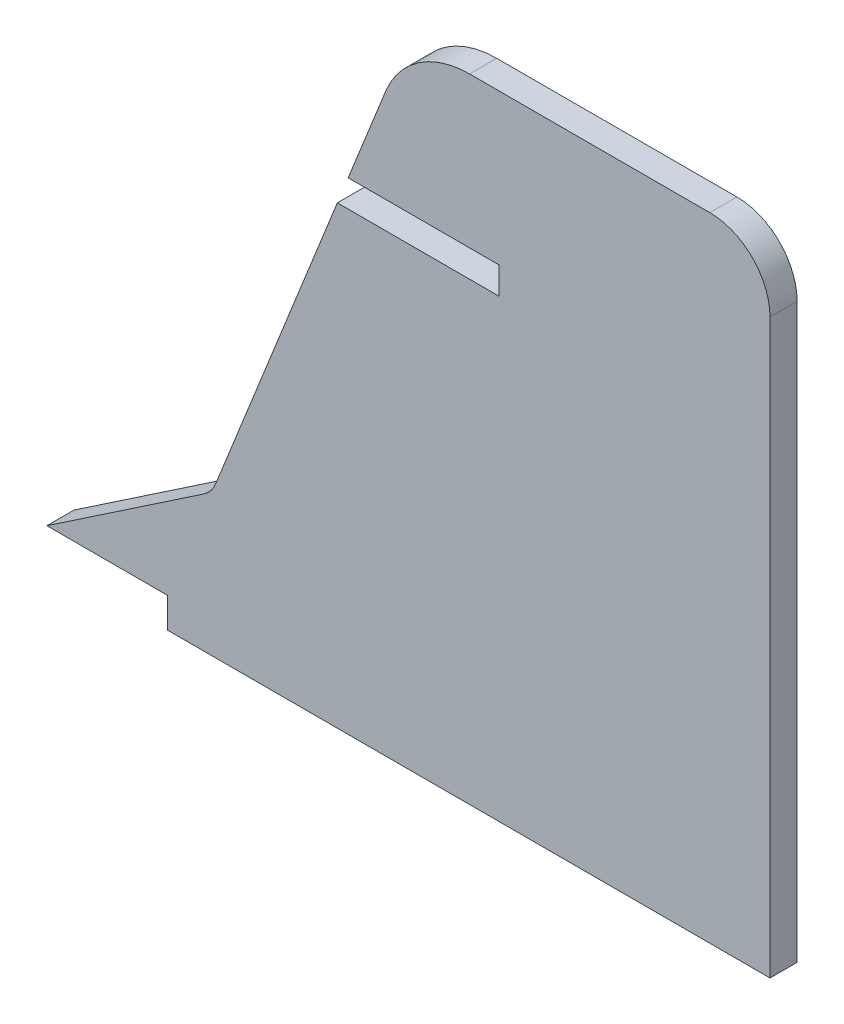
ISO-10303-21;
HEADER;
FILE_DESCRIPTION(('STEP AP214'),'2;1');
FILE_NAME('part.step','',(''),(''),'','','');
FILE_SCHEMA(('AUTOMOTIVE_DESIGN { 1 0 10303 214 1 1 1 1 }'));
ENDSEC;
DATA;
#1=APPLICATION_CONTEXT('core data for automotive mechanical design processes');
#2=APPLICATION_PROTOCOL_DEFINITION('international standard','automotive_design',2000,#1);
#3=PRODUCT_CONTEXT('',#1,'mechanical');
#4=PRODUCT('Part','Part','',(#3));
#5=PRODUCT_RELATED_PRODUCT_CATEGORY('part','',(#4));
#6=PRODUCT_DEFINITION_FORMATION('','',#4);
#7=PRODUCT_DEFINITION_CONTEXT('part definition',#1,'design');
#8=PRODUCT_DEFINITION('design','',#6,#7);
#9=PRODUCT_DEFINITION_SHAPE('','',#8);
#10=(LENGTH_UNIT() NAMED_UNIT(*) SI_UNIT(.MILLI.,.METRE.));
#11=(NAMED_UNIT(*) PLANE_ANGLE_UNIT() SI_UNIT($,.RADIAN.));
#12=(NAMED_UNIT(*) SI_UNIT($,.STERADIAN.) SOLID_ANGLE_UNIT());
#13=UNCERTAINTY_MEASURE_WITH_UNIT(LENGTH_MEASURE(1.E-05),#10,'distance_accuracy_value','');
#14=(GEOMETRIC_REPRESENTATION_CONTEXT(3) GLOBAL_UNCERTAINTY_ASSIGNED_CONTEXT((#13)) GLOBAL_UNIT_ASSIGNED_CONTEXT((#10,
#11,#12)) REPRESENTATION_CONTEXT('',''));
#15=CARTESIAN_POINT('',(0.,0.,0.));
#16=DIRECTION('',(0.,0.,1.));
#17=DIRECTION('',(1.,0.,0.));
#18=AXIS2_PLACEMENT_3D('',#15,#16,#17);
#19=CARTESIAN_POINT('',(0.,0.,4.5));
#20=DIRECTION('',(0.,1.,0.));
#21=DIRECTION('',(-1.,0.,0.));
#22=AXIS2_PLACEMENT_3D('',#19,#20,#21);
#23=PLANE('',#22);
#24=DIRECTION('',(1.,0.,0.));
#25=VECTOR('',#24,1.);
#26=CARTESIAN_POINT('',(0.,0.,0.));
#27=LINE('',#26,#25);
#28=CARTESIAN_POINT('',(-20.,0.,0.));
#29=VERTEX_POINT('',#28);
#30=CARTESIAN_POINT('',(0.,0.,0.));
#31=VERTEX_POINT('',#30);
#32=EDGE_CURVE('E159',#29,#31,#27,.T.);
#33=ORIENTED_EDGE('',*,*,#32,.T.);
#34=DIRECTION('',(0.,0.,-1.));
#35=VECTOR('',#34,1.);
#36=CARTESIAN_POINT('',(0.,0.,4.5));
#37=LINE('',#36,#35);
#38=CARTESIAN_POINT('',(0.,0.,4.5));
#39=VERTEX_POINT('',#38);
#40=EDGE_CURVE('E140',#39,#31,#37,.T.);
#41=ORIENTED_EDGE('',*,*,#40,.F.);
#42=DIRECTION('',(1.,0.,0.));
#43=VECTOR('',#42,1.);
#44=CARTESIAN_POINT('',(0.,0.,4.5));
#45=LINE('',#44,#43);
#46=CARTESIAN_POINT('',(-20.,0.,4.5));
#47=VERTEX_POINT('',#46);
#48=EDGE_CURVE('E147',#47,#39,#45,.T.);
#49=ORIENTED_EDGE('',*,*,#48,.F.);
#50=DIRECTION('',(0.,0.,-1.));
#51=VECTOR('',#50,1.);
#52=CARTESIAN_POINT('',(-20.,0.,4.5));
#53=LINE('',#52,#51);
#54=EDGE_CURVE('E215',#47,#29,#53,.T.);
#55=ORIENTED_EDGE('',*,*,#54,.T.);
#56=EDGE_LOOP('',(#33,#41,#49,#55));
#57=FACE_BOUND('',#56,.T.);
#58=ADVANCED_FACE('F35',(#57),#23,.F.);
#59=CARTESIAN_POINT('',(0.,-5.00000000000001,4.5));
#60=DIRECTION('',(1.,0.,0.));
#61=DIRECTION('',(0.,1.,0.));
#62=AXIS2_PLACEMENT_3D('',#59,#60,#61);
#63=PLANE('',#62);
#64=DIRECTION('',(0.,-1.,0.));
#65=VECTOR('',#64,1.);
#66=CARTESIAN_POINT('',(0.,-5.00000000000001,0.));
#67=LINE('',#66,#65);
#68=CARTESIAN_POINT('',(0.,-5.00000000000001,0.));
#69=VERTEX_POINT('',#68);
#70=EDGE_CURVE('E241',#31,#69,#67,.T.);
#71=ORIENTED_EDGE('',*,*,#70,.T.);
#72=DIRECTION('',(0.,0.,-1.));
#73=VECTOR('',#72,1.);
#74=CARTESIAN_POINT('',(0.,-5.00000000000001,4.5));
#75=LINE('',#74,#73);
#76=CARTESIAN_POINT('',(0.,-5.00000000000001,4.5));
#77=VERTEX_POINT('',#76);
#78=EDGE_CURVE('E143',#77,#69,#75,.T.);
#79=ORIENTED_EDGE('',*,*,#78,.F.);
#80=DIRECTION('',(0.,-1.,0.));
#81=VECTOR('',#80,1.);
#82=CARTESIAN_POINT('',(0.,-5.00000000000001,4.5));
#83=LINE('',#82,#81);
#84=EDGE_CURVE('E136',#39,#77,#83,.T.);
#85=ORIENTED_EDGE('',*,*,#84,.F.);
#86=ORIENTED_EDGE('',*,*,#40,.T.);
#87=EDGE_LOOP('',(#71,#79,#85,#86));
#88=FACE_BOUND('',#87,.T.);
#89=ADVANCED_FACE('F138',(#88),#63,.F.);
#90=CARTESIAN_POINT('',(100.,-5.,4.5));
#91=DIRECTION('',(0.,1.,0.));
#92=DIRECTION('',(-1.,0.,0.));
#93=AXIS2_PLACEMENT_3D('',#90,#91,#92);
#94=PLANE('',#93);
#95=DIRECTION('',(1.,0.,0.));
#96=VECTOR('',#95,1.);
#97=CARTESIAN_POINT('',(100.,-5.,0.));
#98=LINE('',#97,#96);
#99=CARTESIAN_POINT('',(100.,-5.,0.));
#100=VERTEX_POINT('',#99);
#101=EDGE_CURVE('E240',#69,#100,#98,.T.);
#102=ORIENTED_EDGE('',*,*,#101,.T.);
#103=DIRECTION('',(0.,0.,-1.));
#104=VECTOR('',#103,1.);
#105=CARTESIAN_POINT('',(100.,-5.,4.5));
#106=LINE('',#105,#104);
#107=CARTESIAN_POINT('',(100.,-5.,4.5));
#108=VERTEX_POINT('',#107);
#109=EDGE_CURVE('E165',#108,#100,#106,.T.);
#110=ORIENTED_EDGE('',*,*,#109,.F.);
#111=DIRECTION('',(1.,0.,0.));
#112=VECTOR('',#111,1.);
#113=CARTESIAN_POINT('',(100.,-5.,4.5));
#114=LINE('',#113,#112);
#115=EDGE_CURVE('E146',#77,#108,#114,.T.);
#116=ORIENTED_EDGE('',*,*,#115,.F.);
#117=ORIENTED_EDGE('',*,*,#78,.T.);
#118=EDGE_LOOP('',(#102,#110,#116,#117));
#119=FACE_BOUND('',#118,.T.);
#120=ADVANCED_FACE('F238',(#119),#94,.F.);
#121=CARTESIAN_POINT('',(100.,100.,4.5));
#122=DIRECTION('',(-1.,0.,0.));
#123=DIRECTION('',(0.,0.,1.));
#124=AXIS2_PLACEMENT_3D('',#121,#122,#123);
#125=PLANE('',#124);
#126=DIRECTION('',(0.,1.,0.));
#127=VECTOR('',#126,1.);
#128=CARTESIAN_POINT('',(100.,100.,0.));
#129=LINE('',#128,#127);
#130=CARTESIAN_POINT('',(100.,90.,0.));
#131=VERTEX_POINT('',#130);
#132=EDGE_CURVE('E204',#100,#131,#129,.T.);
#133=ORIENTED_EDGE('',*,*,#132,.T.);
#134=DIRECTION('',(0.,0.,-1.));
#135=VECTOR('',#134,1.);
#136=CARTESIAN_POINT('',(100.,90.,4.5));
#137=LINE('',#136,#135);
#138=CARTESIAN_POINT('',(100.,90.,4.5));
#139=VERTEX_POINT('',#138);
#140=EDGE_CURVE('E179',#131,#139,#137,.F.);
#141=ORIENTED_EDGE('',*,*,#140,.T.);
#142=DIRECTION('',(0.,1.,0.));
#143=VECTOR('',#142,1.);
#144=CARTESIAN_POINT('',(100.,0.,4.5));
#145=LINE('',#144,#143);
#146=EDGE_CURVE('E235',#108,#139,#145,.T.);
#147=ORIENTED_EDGE('',*,*,#146,.F.);
#148=ORIENTED_EDGE('',*,*,#109,.T.);
#149=EDGE_LOOP('',(#133,#141,#147,#148));
#150=FACE_BOUND('',#149,.T.);
#151=ADVANCED_FACE('F232',(#150),#125,.F.);
#152=CARTESIAN_POINT('',(40.,100.,4.5));
#153=DIRECTION('',(0.,-1.,0.));
#154=DIRECTION('',(0.,0.,-1.));
#155=AXIS2_PLACEMENT_3D('',#152,#153,#154);
#156=PLANE('',#155);
#157=DIRECTION('',(-1.,0.,0.));
#158=VECTOR('',#157,1.);
#159=CARTESIAN_POINT('',(40.,100.,0.));
#160=LINE('',#159,#158);
#161=CARTESIAN_POINT('',(90.,100.,0.));
#162=VERTEX_POINT('',#161);
#163=CARTESIAN_POINT('',(50.1554944214035,100.,0.));
#164=VERTEX_POINT('',#163);
#165=EDGE_CURVE('E200',#162,#164,#160,.T.);
#166=ORIENTED_EDGE('',*,*,#165,.T.);
#167=DIRECTION('',(0.,0.,-1.));
#168=VECTOR('',#167,1.);
#169=CARTESIAN_POINT('',(50.1554944214035,100.,4.5));
#170=LINE('',#169,#168);
#171=CARTESIAN_POINT('',(50.1554944214035,100.,4.5));
#172=VERTEX_POINT('',#171);
#173=EDGE_CURVE('E43',#164,#172,#170,.F.);
#174=ORIENTED_EDGE('',*,*,#173,.T.);
#175=DIRECTION('',(-1.,0.,0.));
#176=VECTOR('',#175,1.);
#177=CARTESIAN_POINT('',(40.,100.,4.5));
#178=LINE('',#177,#176);
#179=CARTESIAN_POINT('',(90.,100.,4.5));
#180=VERTEX_POINT('',#179);
#181=EDGE_CURVE('E257',#180,#172,#178,.T.);
#182=ORIENTED_EDGE('',*,*,#181,.F.);
#183=DIRECTION('',(0.,0.,-1.));
#184=VECTOR('',#183,1.);
#185=CARTESIAN_POINT('',(90.,100.,4.5));
#186=LINE('',#185,#184);
#187=EDGE_CURVE('E174',#180,#162,#186,.T.);
#188=ORIENTED_EDGE('',*,*,#187,.T.);
#189=EDGE_LOOP('',(#166,#174,#182,#188));
#190=FACE_BOUND('',#189,.T.);
#191=ADVANCED_FACE('F264',(#190),#156,.F.);
#192=CARTESIAN_POINT('',(30.,75.,4.5));
#193=DIRECTION('',(0.928476690885259,-0.371390676354104,0.));
#194=DIRECTION('',(0.371390676354104,0.928476690885259,0.));
#195=AXIS2_PLACEMENT_3D('',#192,#193,#194);
#196=PLANE('',#195);
#197=DIRECTION('',(-0.371390676354104,-0.928476690885259,0.));
#198=VECTOR('',#197,1.);
#199=CARTESIAN_POINT('',(30.,75.,4.5));
#200=LINE('',#199,#198);
#201=CARTESIAN_POINT('',(36.2283440581246,90.5708601453116,4.5));
#202=VERTEX_POINT('',#201);
#203=CARTESIAN_POINT('',(30.,75.,4.5));
#204=VERTEX_POINT('',#203);
#205=EDGE_CURVE('E193',#202,#204,#200,.T.);
#206=ORIENTED_EDGE('',*,*,#205,.F.);
#207=DIRECTION('',(0.,0.,-1.));
#208=VECTOR('',#207,1.);
#209=CARTESIAN_POINT('',(36.2283440581246,90.5708601453116,4.5));
#210=LINE('',#209,#208);
#211=CARTESIAN_POINT('',(36.2283440581246,90.5708601453116,0.));
#212=VERTEX_POINT('',#211);
#213=EDGE_CURVE('E183',#202,#212,#210,.T.);
#214=ORIENTED_EDGE('',*,*,#213,.T.);
#215=DIRECTION('',(-0.371390676354104,-0.928476690885259,0.));
#216=VECTOR('',#215,1.);
#217=CARTESIAN_POINT('',(30.,75.,0.));
#218=LINE('',#217,#216);
#219=CARTESIAN_POINT('',(30.,75.,0.));
#220=VERTEX_POINT('',#219);
#221=EDGE_CURVE('E191',#212,#220,#218,.T.);
#222=ORIENTED_EDGE('',*,*,#221,.T.);
#223=DIRECTION('',(0.,0.,-1.));
#224=VECTOR('',#223,1.);
#225=CARTESIAN_POINT('',(30.,75.,4.5));
#226=LINE('',#225,#224);
#227=EDGE_CURVE('E226',#204,#220,#226,.T.);
#228=ORIENTED_EDGE('',*,*,#227,.F.);
#229=EDGE_LOOP('',(#206,#214,#222,#228));
#230=FACE_BOUND('',#229,.T.);
#231=ADVANCED_FACE('F189',(#230),#196,.F.);
#232=CARTESIAN_POINT('',(30.,75.,4.5));
#233=DIRECTION('',(0.,1.,0.));
#234=DIRECTION('',(0.,0.,1.));
#235=AXIS2_PLACEMENT_3D('',#232,#233,#234);
#236=PLANE('',#235);
#237=DIRECTION('',(1.,0.,0.));
#238=VECTOR('',#237,1.);
#239=CARTESIAN_POINT('',(30.,75.,0.));
#240=LINE('',#239,#238);
#241=CARTESIAN_POINT('',(55.,75.,0.));
#242=VERTEX_POINT('',#241);
#243=EDGE_CURVE('E199',#220,#242,#240,.T.);
#244=ORIENTED_EDGE('',*,*,#243,.T.);
#245=DIRECTION('',(0.,0.,-1.));
#246=VECTOR('',#245,1.);
#247=CARTESIAN_POINT('',(55.,75.,4.5));
#248=LINE('',#247,#246);
#249=CARTESIAN_POINT('',(55.,75.,4.5));
#250=VERTEX_POINT('',#249);
#251=EDGE_CURVE('E223',#250,#242,#248,.T.);
#252=ORIENTED_EDGE('',*,*,#251,.F.);
#253=DIRECTION('',(1.,0.,0.));
#254=VECTOR('',#253,1.);
#255=CARTESIAN_POINT('',(30.,75.,4.5));
#256=LINE('',#255,#254);
#257=EDGE_CURVE('E254',#204,#250,#256,.T.);
#258=ORIENTED_EDGE('',*,*,#257,.F.);
#259=ORIENTED_EDGE('',*,*,#227,.T.);
#260=EDGE_LOOP('',(#244,#252,#258,#259));
#261=FACE_BOUND('',#260,.T.);
#262=ADVANCED_FACE('F306',(#261),#236,.F.);
#263=CARTESIAN_POINT('',(55.,75.,4.5));
#264=DIRECTION('',(1.,0.,0.));
#265=DIRECTION('',(0.,0.,-1.));
#266=AXIS2_PLACEMENT_3D('',#263,#264,#265);
#267=PLANE('',#266);
#268=DIRECTION('',(0.,-1.,0.));
#269=VECTOR('',#268,1.);
#270=CARTESIAN_POINT('',(55.,75.,0.));
#271=LINE('',#270,#269);
#272=CARTESIAN_POINT('',(55.,70.5,0.));
#273=VERTEX_POINT('',#272);
#274=EDGE_CURVE('E202',#242,#273,#271,.T.);
#275=ORIENTED_EDGE('',*,*,#274,.T.);
#276=DIRECTION('',(0.,0.,-1.));
#277=VECTOR('',#276,1.);
#278=CARTESIAN_POINT('',(55.,70.5,4.5));
#279=LINE('',#278,#277);
#280=CARTESIAN_POINT('',(55.,70.5,4.5));
#281=VERTEX_POINT('',#280);
#282=EDGE_CURVE('E220',#281,#273,#279,.T.);
#283=ORIENTED_EDGE('',*,*,#282,.F.);
#284=DIRECTION('',(0.,-1.,0.));
#285=VECTOR('',#284,1.);
#286=CARTESIAN_POINT('',(55.,75.,4.5));
#287=LINE('',#286,#285);
#288=EDGE_CURVE('E252',#250,#281,#287,.T.);
#289=ORIENTED_EDGE('',*,*,#288,.F.);
#290=ORIENTED_EDGE('',*,*,#251,.T.);
#291=EDGE_LOOP('',(#275,#283,#289,#290));
#292=FACE_BOUND('',#291,.T.);
#293=ADVANCED_FACE('F301',(#292),#267,.F.);
#294=CARTESIAN_POINT('',(55.,70.5,4.5));
#295=DIRECTION('',(0.,-1.,0.));
#296=DIRECTION('',(0.,0.,-1.));
#297=AXIS2_PLACEMENT_3D('',#294,#295,#296);
#298=PLANE('',#297);
#299=DIRECTION('',(-1.,0.,0.));
#300=VECTOR('',#299,1.);
#301=CARTESIAN_POINT('',(55.,70.5,0.));
#302=LINE('',#301,#300);
#303=CARTESIAN_POINT('',(28.2,70.5,0.));
#304=VERTEX_POINT('',#303);
#305=EDGE_CURVE('E209',#273,#304,#302,.T.);
#306=ORIENTED_EDGE('',*,*,#305,.T.);
#307=DIRECTION('',(0.,0.,-1.));
#308=VECTOR('',#307,1.);
#309=CARTESIAN_POINT('',(28.2,70.5,4.5));
#310=LINE('',#309,#308);
#311=CARTESIAN_POINT('',(28.2,70.5,4.5));
#312=VERTEX_POINT('',#311);
#313=EDGE_CURVE('E217',#312,#304,#310,.T.);
#314=ORIENTED_EDGE('',*,*,#313,.F.);
#315=DIRECTION('',(-1.,0.,0.));
#316=VECTOR('',#315,1.);
#317=CARTESIAN_POINT('',(55.,70.5,4.5));
#318=LINE('',#317,#316);
#319=EDGE_CURVE('E250',#281,#312,#318,.T.);
#320=ORIENTED_EDGE('',*,*,#319,.F.);
#321=ORIENTED_EDGE('',*,*,#282,.T.);
#322=EDGE_LOOP('',(#306,#314,#320,#321));
#323=FACE_BOUND('',#322,.T.);
#324=ADVANCED_FACE('F298',(#323),#298,.F.);
#325=CARTESIAN_POINT('',(7.4,18.5,4.5));
#326=DIRECTION('',(0.928476690885259,-0.371390676354104,0.));
#327=DIRECTION('',(0.371390676354104,0.928476690885259,0.));
#328=AXIS2_PLACEMENT_3D('',#325,#326,#327);
#329=PLANE('',#328);
#330=DIRECTION('',(-0.371390676354104,-0.928476690885259,0.));
#331=VECTOR('',#330,1.);
#332=CARTESIAN_POINT('',(7.4,18.5,0.));
#333=LINE('',#332,#331);
#334=CARTESIAN_POINT('',(7.97077784334584,19.9269446083646,0.));
#335=VERTEX_POINT('',#334);
#336=EDGE_CURVE('E211',#304,#335,#333,.T.);
#337=ORIENTED_EDGE('',*,*,#336,.T.);
#338=DIRECTION('',(0.,0.,-1.));
#339=VECTOR('',#338,1.);
#340=CARTESIAN_POINT('',(7.97077784334584,19.9269446083646,4.5));
#341=LINE('',#340,#339);
#342=CARTESIAN_POINT('',(7.97077784334584,19.9269446083646,4.5));
#343=VERTEX_POINT('',#342);
#344=EDGE_CURVE('E163',#335,#343,#341,.F.);
#345=ORIENTED_EDGE('',*,*,#344,.T.);
#346=DIRECTION('',(-0.371390676354104,-0.928476690885259,0.));
#347=VECTOR('',#346,1.);
#348=CARTESIAN_POINT('',(7.4,18.5,4.5));
#349=LINE('',#348,#347);
#350=EDGE_CURVE('E247',#312,#343,#349,.T.);
#351=ORIENTED_EDGE('',*,*,#350,.F.);
#352=ORIENTED_EDGE('',*,*,#313,.T.);
#353=EDGE_LOOP('',(#337,#345,#351,#352));
#354=FACE_BOUND('',#353,.T.);
#355=ADVANCED_FACE('F294',(#354),#329,.F.);
#356=CARTESIAN_POINT('',(-20.,0.,4.5));
#357=DIRECTION('',(0.559576748902898,-0.82877853621294,0.));
#358=DIRECTION('',(0.82877853621294,0.559576748902898,0.));
#359=AXIS2_PLACEMENT_3D('',#356,#357,#358);
#360=PLANE('',#359);
#361=DIRECTION('',(-0.82877853621294,-0.559576748902898,0.));
#362=VECTOR('',#361,1.);
#363=CARTESIAN_POINT('',(-20.,0.,4.5));
#364=LINE('',#363,#362);
#365=CARTESIAN_POINT('',(6.12627813343404,17.6400053090704,4.5));
#366=VERTEX_POINT('',#365);
#367=EDGE_CURVE('E152',#366,#47,#364,.T.);
#368=ORIENTED_EDGE('',*,*,#367,.F.);
#369=DIRECTION('',(0.,0.,-1.));
#370=VECTOR('',#369,1.);
#371=CARTESIAN_POINT('',(6.12627813343404,17.6400053090704,0.));
#372=LINE('',#371,#370);
#373=CARTESIAN_POINT('',(6.12627813343404,17.6400053090704,0.));
#374=VERTEX_POINT('',#373);
#375=EDGE_CURVE('E160',#366,#374,#372,.T.);
#376=ORIENTED_EDGE('',*,*,#375,.T.);
#377=DIRECTION('',(-0.82877853621294,-0.559576748902898,0.));
#378=VECTOR('',#377,1.);
#379=CARTESIAN_POINT('',(-20.,0.,0.));
#380=LINE('',#379,#378);
#381=EDGE_CURVE('E156',#374,#29,#380,.T.);
#382=ORIENTED_EDGE('',*,*,#381,.T.);
#383=ORIENTED_EDGE('',*,*,#54,.F.);
#384=EDGE_LOOP('',(#368,#376,#382,#383));
#385=FACE_BOUND('',#384,.T.);
#386=ADVANCED_FACE('F289',(#385),#360,.F.);
#387=CARTESIAN_POINT('',(0.,0.,4.5));
#388=DIRECTION('',(0.,0.,1.));
#389=DIRECTION('',(1.,0.,0.));
#390=AXIS2_PLACEMENT_3D('',#387,#388,#389);
#391=PLANE('',#390);
#392=ORIENTED_EDGE('',*,*,#181,.T.);
#393=CARTESIAN_POINT('',(50.1554944214035,85.,4.5));
#394=DIRECTION('',(0.,0.,1.));
#395=DIRECTION('',(1.,0.,0.));
#396=AXIS2_PLACEMENT_3D('',#393,#394,#395);
#397=CIRCLE('',#396,15.);
#398=EDGE_CURVE('E11',#172,#202,#397,.T.);
#399=ORIENTED_EDGE('',*,*,#398,.T.);
#400=ORIENTED_EDGE('',*,*,#205,.T.);
#401=ORIENTED_EDGE('',*,*,#257,.T.);
#402=ORIENTED_EDGE('',*,*,#288,.T.);
#403=ORIENTED_EDGE('',*,*,#319,.T.);
#404=ORIENTED_EDGE('',*,*,#350,.T.);
#405=CARTESIAN_POINT('',(3.32839438891955,21.7838979901351,4.5));
#406=DIRECTION('',(0.,0.,1.));
#407=DIRECTION('',(1.,0.,0.));
#408=AXIS2_PLACEMENT_3D('',#405,#406,#407);
#409=CIRCLE('',#408,5.);
#410=EDGE_CURVE('E172',#343,#366,#409,.F.);
#411=ORIENTED_EDGE('',*,*,#410,.T.);
#412=ORIENTED_EDGE('',*,*,#367,.T.);
#413=ORIENTED_EDGE('',*,*,#48,.T.);
#414=ORIENTED_EDGE('',*,*,#84,.T.);
#415=ORIENTED_EDGE('',*,*,#115,.T.);
#416=ORIENTED_EDGE('',*,*,#146,.T.);
#417=CARTESIAN_POINT('',(90.,90.,4.5));
#418=DIRECTION('',(0.,0.,1.));
#419=DIRECTION('',(1.,0.,0.));
#420=AXIS2_PLACEMENT_3D('',#417,#418,#419);
#421=CIRCLE('',#420,10.);
#422=EDGE_CURVE('E181',#139,#180,#421,.T.);
#423=ORIENTED_EDGE('',*,*,#422,.T.);
#424=EDGE_LOOP('',(#392,#399,#400,#401,#402,#403,#404,#411,#412,#413,#414,#415,#416,#423));
#425=FACE_BOUND('',#424,.T.);
#426=ADVANCED_FACE('F150',(#425),#391,.T.);
#427=CARTESIAN_POINT('',(0.,0.,0.));
#428=DIRECTION('',(0.,0.,1.));
#429=DIRECTION('',(1.,0.,0.));
#430=AXIS2_PLACEMENT_3D('',#427,#428,#429);
#431=PLANE('',#430);
#432=ORIENTED_EDGE('',*,*,#221,.F.);
#433=CARTESIAN_POINT('',(50.1554944214035,85.,0.));
#434=DIRECTION('',(0.,0.,1.));
#435=DIRECTION('',(1.,0.,0.));
#436=AXIS2_PLACEMENT_3D('',#433,#434,#435);
#437=CIRCLE('',#436,15.);
#438=EDGE_CURVE('E57',#212,#164,#437,.F.);
#439=ORIENTED_EDGE('',*,*,#438,.T.);
#440=ORIENTED_EDGE('',*,*,#165,.F.);
#441=CARTESIAN_POINT('',(90.,90.,0.));
#442=DIRECTION('',(0.,0.,1.));
#443=DIRECTION('',(1.,0.,0.));
#444=AXIS2_PLACEMENT_3D('',#441,#442,#443);
#445=CIRCLE('',#444,10.);
#446=EDGE_CURVE('E177',#162,#131,#445,.F.);
#447=ORIENTED_EDGE('',*,*,#446,.T.);
#448=ORIENTED_EDGE('',*,*,#132,.F.);
#449=ORIENTED_EDGE('',*,*,#101,.F.);
#450=ORIENTED_EDGE('',*,*,#70,.F.);
#451=ORIENTED_EDGE('',*,*,#32,.F.);
#452=ORIENTED_EDGE('',*,*,#381,.F.);
#453=CARTESIAN_POINT('',(3.32839438891955,21.7838979901351,0.));
#454=DIRECTION('',(0.,0.,1.));
#455=DIRECTION('',(1.,0.,0.));
#456=AXIS2_PLACEMENT_3D('',#453,#454,#455);
#457=CIRCLE('',#456,5.);
#458=EDGE_CURVE('E170',#374,#335,#457,.T.);
#459=ORIENTED_EDGE('',*,*,#458,.T.);
#460=ORIENTED_EDGE('',*,*,#336,.F.);
#461=ORIENTED_EDGE('',*,*,#305,.F.);
#462=ORIENTED_EDGE('',*,*,#274,.F.);
#463=ORIENTED_EDGE('',*,*,#243,.F.);
#464=EDGE_LOOP('',(#432,#439,#440,#447,#448,#449,#450,#451,#452,#459,#460,#461,#462,#463));
#465=FACE_BOUND('',#464,.T.);
#466=ADVANCED_FACE('F197',(#465),#431,.F.);
#467=CARTESIAN_POINT('',(3.32839438891955,21.7838979901351,4.5));
#468=DIRECTION('',(0.,0.,1.));
#469=DIRECTION('',(1.,0.,0.));
#470=AXIS2_PLACEMENT_3D('',#467,#468,#469);
#471=CYLINDRICAL_SURFACE('',#470,5.);
#472=ORIENTED_EDGE('',*,*,#410,.F.);
#473=ORIENTED_EDGE('',*,*,#344,.F.);
#474=ORIENTED_EDGE('',*,*,#458,.F.);
#475=ORIENTED_EDGE('',*,*,#375,.F.);
#476=EDGE_LOOP('',(#472,#473,#474,#475));
#477=FACE_BOUND('',#476,.T.);
#478=ADVANCED_FACE('F269',(#477),#471,.F.);
#479=CARTESIAN_POINT('',(90.,90.,4.5));
#480=DIRECTION('',(0.,0.,-1.));
#481=DIRECTION('',(-1.,0.,0.));
#482=AXIS2_PLACEMENT_3D('',#479,#480,#481);
#483=CYLINDRICAL_SURFACE('',#482,10.);
#484=ORIENTED_EDGE('',*,*,#422,.F.);
#485=ORIENTED_EDGE('',*,*,#140,.F.);
#486=ORIENTED_EDGE('',*,*,#446,.F.);
#487=ORIENTED_EDGE('',*,*,#187,.F.);
#488=EDGE_LOOP('',(#484,#485,#486,#487));
#489=FACE_BOUND('',#488,.T.);
#490=ADVANCED_FACE('F263',(#489),#483,.T.);
#491=CARTESIAN_POINT('',(50.1554944214035,85.,4.5));
#492=DIRECTION('',(0.,0.,-1.));
#493=DIRECTION('',(-1.,0.,0.));
#494=AXIS2_PLACEMENT_3D('',#491,#492,#493);
#495=CYLINDRICAL_SURFACE('',#494,15.);
#496=ORIENTED_EDGE('',*,*,#398,.F.);
#497=ORIENTED_EDGE('',*,*,#173,.F.);
#498=ORIENTED_EDGE('',*,*,#438,.F.);
#499=ORIENTED_EDGE('',*,*,#213,.F.);
#500=EDGE_LOOP('',(#496,#497,#498,#499));
#501=FACE_BOUND('',#500,.T.);
#502=ADVANCED_FACE('F37',(#501),#495,.T.);
#503=CLOSED_SHELL('',(#58,#89,#120,#151,#191,#231,#262,#293,#324,#355,#386,#426,#466,#478,#490,#502));
#504=MANIFOLD_SOLID_BREP('B2',#503);
#505=ADVANCED_BREP_SHAPE_REPRESENTATION('',(#18,#504),#14);
#506=SHAPE_DEFINITION_REPRESENTATION(#9,#505);
ENDSEC;
END-ISO-10303-21;
